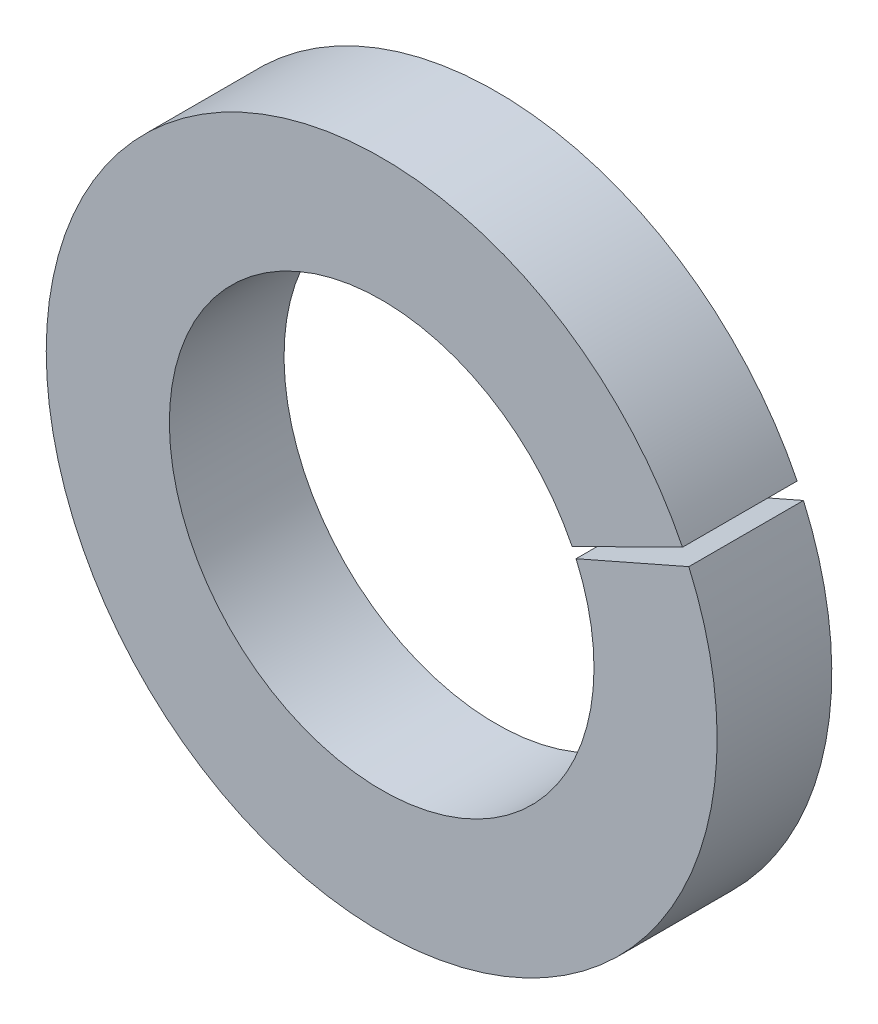
ISO-10303-21;
HEADER;
FILE_DESCRIPTION(('STEP AP214'),'2;1');
FILE_NAME('part.step','',(''),(''),'','','');
FILE_SCHEMA(('AUTOMOTIVE_DESIGN { 1 0 10303 214 1 1 1 1 }'));
ENDSEC;
DATA;
#1=APPLICATION_CONTEXT('core data for automotive mechanical design processes');
#2=APPLICATION_PROTOCOL_DEFINITION('international standard','automotive_design',2000,#1);
#3=PRODUCT_CONTEXT('',#1,'mechanical');
#4=PRODUCT('Part','Part','',(#3));
#5=PRODUCT_RELATED_PRODUCT_CATEGORY('part','',(#4));
#6=PRODUCT_DEFINITION_FORMATION('','',#4);
#7=PRODUCT_DEFINITION_CONTEXT('part definition',#1,'design');
#8=PRODUCT_DEFINITION('design','',#6,#7);
#9=PRODUCT_DEFINITION_SHAPE('','',#8);
#10=(LENGTH_UNIT() NAMED_UNIT(*) SI_UNIT(.MILLI.,.METRE.));
#11=(NAMED_UNIT(*) PLANE_ANGLE_UNIT() SI_UNIT($,.RADIAN.));
#12=(NAMED_UNIT(*) SI_UNIT($,.STERADIAN.) SOLID_ANGLE_UNIT());
#13=UNCERTAINTY_MEASURE_WITH_UNIT(LENGTH_MEASURE(1.E-05),#10,'distance_accuracy_value','');
#14=(GEOMETRIC_REPRESENTATION_CONTEXT(3) GLOBAL_UNCERTAINTY_ASSIGNED_CONTEXT((#13)) GLOBAL_UNIT_ASSIGNED_CONTEXT((#10,
#11,#12)) REPRESENTATION_CONTEXT('',''));
#15=CARTESIAN_POINT('',(0.,0.,0.));
#16=DIRECTION('',(0.,0.,1.));
#17=DIRECTION('',(1.,0.,0.));
#18=AXIS2_PLACEMENT_3D('',#15,#16,#17);
#19=CARTESIAN_POINT('',(0.,0.,2.7));
#20=DIRECTION('',(0.,0.,1.));
#21=DIRECTION('',(1.,0.,0.));
#22=AXIS2_PLACEMENT_3D('',#19,#20,#21);
#23=PLANE('',#22);
#24=DIRECTION('',(0.915627432100714,0.402027866676742,0.));
#25=VECTOR('',#24,1.);
#26=CARTESIAN_POINT('',(8.17145168093703,3.58786900847008,2.7));
#27=LINE('',#26,#25);
#28=CARTESIAN_POINT('',(4.57813716050357,2.01013933338371,2.7));
#29=VERTEX_POINT('',#28);
#30=CARTESIAN_POINT('',(7.23345671359564,3.17602014674627,2.7));
#31=VERTEX_POINT('',#30);
#32=EDGE_CURVE('E76',#29,#31,#27,.T.);
#33=ORIENTED_EDGE('',*,*,#32,.F.);
#34=CARTESIAN_POINT('',(0.,0.,2.7));
#35=DIRECTION('',(0.,0.,1.));
#36=DIRECTION('',(1.,0.,0.));
#37=AXIS2_PLACEMENT_3D('',#34,#35,#36);
#38=CIRCLE('',#37,5.);
#39=CARTESIAN_POINT('',(4.48350231587069,2.21318932393552,2.7));
#40=VERTEX_POINT('',#39);
#41=EDGE_CURVE('E85',#40,#29,#38,.T.);
#42=ORIENTED_EDGE('',*,*,#41,.F.);
#43=DIRECTION('',(-0.896700463174137,-0.442637864787105,0.));
#44=VECTOR('',#43,1.);
#45=CARTESIAN_POINT('',(0.,0.,2.7));
#46=LINE('',#45,#44);
#47=CARTESIAN_POINT('',(7.08393365907569,3.49683913181813,2.7));
#48=VERTEX_POINT('',#47);
#49=EDGE_CURVE('E59',#48,#40,#46,.T.);
#50=ORIENTED_EDGE('',*,*,#49,.F.);
#51=CARTESIAN_POINT('',(0.,0.,2.7));
#52=DIRECTION('',(0.,0.,1.));
#53=DIRECTION('',(1.,0.,0.));
#54=AXIS2_PLACEMENT_3D('',#51,#52,#53);
#55=CIRCLE('',#54,7.9);
#56=EDGE_CURVE('E87',#48,#31,#55,.T.);
#57=ORIENTED_EDGE('',*,*,#56,.T.);
#58=EDGE_LOOP('',(#33,#42,#50,#57));
#59=FACE_BOUND('',#58,.T.);
#60=ADVANCED_FACE('F37',(#59),#23,.T.);
#61=CARTESIAN_POINT('',(0.,0.,0.));
#62=DIRECTION('',(0.,0.,1.));
#63=DIRECTION('',(1.,0.,0.));
#64=AXIS2_PLACEMENT_3D('',#61,#62,#63);
#65=PLANE('',#64);
#66=CARTESIAN_POINT('',(0.,0.,0.));
#67=DIRECTION('',(0.,0.,1.));
#68=DIRECTION('',(1.,0.,0.));
#69=AXIS2_PLACEMENT_3D('',#66,#67,#68);
#70=CIRCLE('',#69,5.);
#71=CARTESIAN_POINT('',(4.48350231587069,2.21318932393552,0.));
#72=VERTEX_POINT('',#71);
#73=CARTESIAN_POINT('',(4.57813716050357,2.01013933338371,0.));
#74=VERTEX_POINT('',#73);
#75=EDGE_CURVE('E91',#72,#74,#70,.T.);
#76=ORIENTED_EDGE('',*,*,#75,.T.);
#77=DIRECTION('',(0.915627432100714,0.402027866676743,0.));
#78=VECTOR('',#77,1.);
#79=CARTESIAN_POINT('',(0.,0.,0.));
#80=LINE('',#79,#78);
#81=CARTESIAN_POINT('',(7.23345671359564,3.17602014674627,0.));
#82=VERTEX_POINT('',#81);
#83=EDGE_CURVE('E51',#74,#82,#80,.T.);
#84=ORIENTED_EDGE('',*,*,#83,.T.);
#85=CARTESIAN_POINT('',(0.,0.,0.));
#86=DIRECTION('',(0.,0.,1.));
#87=DIRECTION('',(1.,0.,0.));
#88=AXIS2_PLACEMENT_3D('',#85,#86,#87);
#89=CIRCLE('',#88,7.9);
#90=CARTESIAN_POINT('',(7.08393365907569,3.49683913181813,0.));
#91=VERTEX_POINT('',#90);
#92=EDGE_CURVE('E90',#91,#82,#89,.T.);
#93=ORIENTED_EDGE('',*,*,#92,.F.);
#94=DIRECTION('',(-0.896700463174138,-0.442637864787105,0.));
#95=VECTOR('',#94,1.);
#96=CARTESIAN_POINT('',(0.,0.,0.));
#97=LINE('',#96,#95);
#98=EDGE_CURVE('E102',#91,#72,#97,.T.);
#99=ORIENTED_EDGE('',*,*,#98,.T.);
#100=EDGE_LOOP('',(#76,#84,#93,#99));
#101=FACE_BOUND('',#100,.T.);
#102=ADVANCED_FACE('F106',(#101),#65,.F.);
#103=CARTESIAN_POINT('',(0.,0.,2.7));
#104=DIRECTION('',(0.,0.,-1.));
#105=DIRECTION('',(-1.,0.,0.));
#106=AXIS2_PLACEMENT_3D('',#103,#104,#105);
#107=CYLINDRICAL_SURFACE('',#106,7.9);
#108=ORIENTED_EDGE('',*,*,#92,.T.);
#109=DIRECTION('',(0.,0.,-1.));
#110=VECTOR('',#109,1.);
#111=CARTESIAN_POINT('',(7.23345671359564,3.17602014674626,2.7));
#112=LINE('',#111,#110);
#113=EDGE_CURVE('E95',#82,#31,#112,.F.);
#114=ORIENTED_EDGE('',*,*,#113,.T.);
#115=ORIENTED_EDGE('',*,*,#56,.F.);
#116=DIRECTION('',(0.,0.,-1.));
#117=VECTOR('',#116,1.);
#118=CARTESIAN_POINT('',(7.08393365907569,3.49683913181813,2.7));
#119=LINE('',#118,#117);
#120=EDGE_CURVE('E107',#48,#91,#119,.T.);
#121=ORIENTED_EDGE('',*,*,#120,.T.);
#122=EDGE_LOOP('',(#108,#114,#115,#121));
#123=FACE_BOUND('',#122,.T.);
#124=ADVANCED_FACE('F39',(#123),#107,.T.);
#125=CARTESIAN_POINT('',(0.,0.,2.7));
#126=DIRECTION('',(0.,0.,-1.));
#127=DIRECTION('',(-1.,0.,0.));
#128=AXIS2_PLACEMENT_3D('',#125,#126,#127);
#129=CYLINDRICAL_SURFACE('',#128,5.);
#130=DIRECTION('',(0.,0.,-1.));
#131=VECTOR('',#130,1.);
#132=CARTESIAN_POINT('',(4.57813716050357,2.01013933338371,2.7));
#133=LINE('',#132,#131);
#134=EDGE_CURVE('E11',#74,#29,#133,.F.);
#135=ORIENTED_EDGE('',*,*,#134,.F.);
#136=ORIENTED_EDGE('',*,*,#75,.F.);
#137=DIRECTION('',(0.,0.,-1.));
#138=VECTOR('',#137,1.);
#139=CARTESIAN_POINT('',(4.48350231587069,2.21318932393552,2.7));
#140=LINE('',#139,#138);
#141=EDGE_CURVE('E45',#40,#72,#140,.T.);
#142=ORIENTED_EDGE('',*,*,#141,.F.);
#143=ORIENTED_EDGE('',*,*,#41,.T.);
#144=EDGE_LOOP('',(#135,#136,#142,#143));
#145=FACE_BOUND('',#144,.T.);
#146=ADVANCED_FACE('F89',(#145),#129,.F.);
#147=CARTESIAN_POINT('',(0.,0.,-7.3));
#148=DIRECTION('',(-0.442637864787105,0.896700463174138,0.));
#149=DIRECTION('',(-0.896700463174138,-0.442637864787105,0.));
#150=AXIS2_PLACEMENT_3D('',#147,#148,#149);
#151=PLANE('',#150);
#152=ORIENTED_EDGE('',*,*,#49,.T.);
#153=ORIENTED_EDGE('',*,*,#141,.T.);
#154=ORIENTED_EDGE('',*,*,#98,.F.);
#155=ORIENTED_EDGE('',*,*,#120,.F.);
#156=EDGE_LOOP('',(#152,#153,#154,#155));
#157=FACE_BOUND('',#156,.T.);
#158=ADVANCED_FACE('F101',(#157),#151,.F.);
#159=CARTESIAN_POINT('',(8.17145168093703,3.58786900847008,-7.3));
#160=DIRECTION('',(0.402027866676742,-0.915627432100714,0.));
#161=DIRECTION('',(0.915627432100714,0.402027866676743,0.));
#162=AXIS2_PLACEMENT_3D('',#159,#160,#161);
#163=PLANE('',#162);
#164=ORIENTED_EDGE('',*,*,#83,.F.);
#165=ORIENTED_EDGE('',*,*,#134,.T.);
#166=ORIENTED_EDGE('',*,*,#32,.T.);
#167=ORIENTED_EDGE('',*,*,#113,.F.);
#168=EDGE_LOOP('',(#164,#165,#166,#167));
#169=FACE_BOUND('',#168,.T.);
#170=ADVANCED_FACE('F75',(#169),#163,.F.);
#171=CLOSED_SHELL('',(#60,#102,#124,#146,#158,#170));
#172=MANIFOLD_SOLID_BREP('B2',#171);
#173=ADVANCED_BREP_SHAPE_REPRESENTATION('',(#18,#172),#14);
#174=SHAPE_DEFINITION_REPRESENTATION(#9,#173);
ENDSEC;
END-ISO-10303-21;
